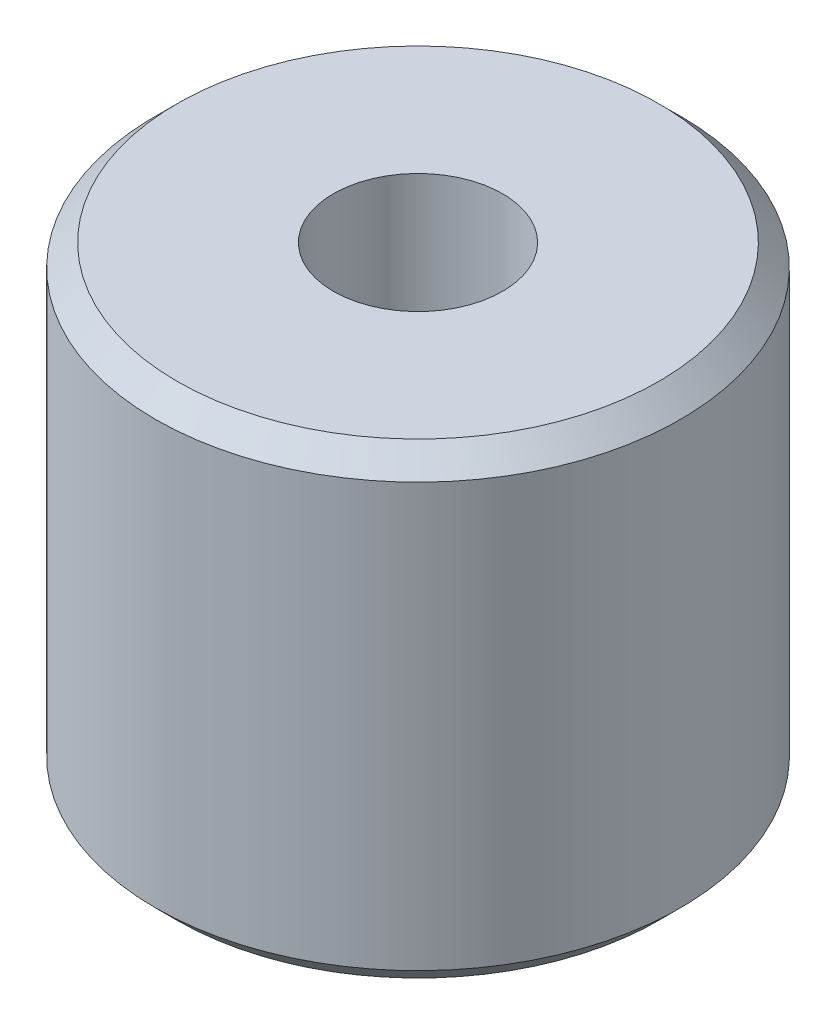
ISO-10303-21;
HEADER;
FILE_DESCRIPTION(('STEP AP214'),'2;1');
FILE_NAME('part.step','',(''),(''),'','','');
FILE_SCHEMA(('AUTOMOTIVE_DESIGN { 1 0 10303 214 1 1 1 1 }'));
ENDSEC;
DATA;
#1=APPLICATION_CONTEXT('core data for automotive mechanical design processes');
#2=APPLICATION_PROTOCOL_DEFINITION('international standard','automotive_design',2000,#1);
#3=PRODUCT_CONTEXT('',#1,'mechanical');
#4=PRODUCT('Part','Part','',(#3));
#5=PRODUCT_RELATED_PRODUCT_CATEGORY('part','',(#4));
#6=PRODUCT_DEFINITION_FORMATION('','',#4);
#7=PRODUCT_DEFINITION_CONTEXT('part definition',#1,'design');
#8=PRODUCT_DEFINITION('design','',#6,#7);
#9=PRODUCT_DEFINITION_SHAPE('','',#8);
#10=(LENGTH_UNIT() NAMED_UNIT(*) SI_UNIT(.MILLI.,.METRE.));
#11=(NAMED_UNIT(*) PLANE_ANGLE_UNIT() SI_UNIT($,.RADIAN.));
#12=(NAMED_UNIT(*) SI_UNIT($,.STERADIAN.) SOLID_ANGLE_UNIT());
#13=UNCERTAINTY_MEASURE_WITH_UNIT(LENGTH_MEASURE(1.E-05),#10,'distance_accuracy_value','');
#14=(GEOMETRIC_REPRESENTATION_CONTEXT(3) GLOBAL_UNCERTAINTY_ASSIGNED_CONTEXT((#13)) GLOBAL_UNIT_ASSIGNED_CONTEXT((#10,
#11,#12)) REPRESENTATION_CONTEXT('',''));
#15=CARTESIAN_POINT('',(0.,0.,0.));
#16=DIRECTION('',(0.,0.,1.));
#17=DIRECTION('',(1.,0.,0.));
#18=AXIS2_PLACEMENT_3D('',#15,#16,#17);
#19=CARTESIAN_POINT('',(0.,32.,0.));
#20=DIRECTION('',(0.,-1.,0.));
#21=DIRECTION('',(0.,0.,-1.));
#22=AXIS2_PLACEMENT_3D('',#19,#20,#21);
#23=CYLINDRICAL_SURFACE('',#22,18.);
#24=CARTESIAN_POINT('',(0.,30.5,0.));
#25=DIRECTION('',(0.,1.,0.));
#26=DIRECTION('',(0.,0.,1.));
#27=AXIS2_PLACEMENT_3D('',#24,#25,#26);
#28=CIRCLE('',#27,18.);
#29=CARTESIAN_POINT('',(0.,30.5,18.));
#30=VERTEX_POINT('',#29);
#31=EDGE_CURVE('E47',#30,#30,#28,.F.);
#32=ORIENTED_EDGE('',*,*,#31,.T.);
#33=EDGE_LOOP('',(#32));
#34=FACE_BOUND('',#33,.T.);
#35=CARTESIAN_POINT('',(0.,1.5,0.));
#36=DIRECTION('',(0.,1.,0.));
#37=DIRECTION('',(0.,0.,1.));
#38=AXIS2_PLACEMENT_3D('',#35,#36,#37);
#39=CIRCLE('',#38,18.);
#40=CARTESIAN_POINT('',(0.,1.5,18.));
#41=VERTEX_POINT('',#40);
#42=EDGE_CURVE('E51',#41,#41,#39,.T.);
#43=ORIENTED_EDGE('',*,*,#42,.T.);
#44=EDGE_LOOP('',(#43));
#45=FACE_BOUND('',#44,.T.);
#46=ADVANCED_FACE('F39',(#34,#45),#23,.T.);
#47=CARTESIAN_POINT('',(0.,32.,0.));
#48=DIRECTION('',(0.,1.,0.));
#49=DIRECTION('',(0.,0.,1.));
#50=AXIS2_PLACEMENT_3D('',#47,#48,#49);
#51=PLANE('',#50);
#52=CARTESIAN_POINT('',(0.,32.,0.));
#53=DIRECTION('',(0.,1.,0.));
#54=DIRECTION('',(0.,0.,1.));
#55=AXIS2_PLACEMENT_3D('',#52,#53,#54);
#56=CIRCLE('',#55,16.5);
#57=CARTESIAN_POINT('',(0.,32.,16.5));
#58=VERTEX_POINT('',#57);
#59=EDGE_CURVE('E55',#58,#58,#56,.T.);
#60=ORIENTED_EDGE('',*,*,#59,.T.);
#61=EDGE_LOOP('',(#60));
#62=FACE_BOUND('',#61,.T.);
#63=CARTESIAN_POINT('',(0.,32.,0.));
#64=DIRECTION('',(0.,1.,0.));
#65=DIRECTION('',(0.,0.,1.));
#66=AXIS2_PLACEMENT_3D('',#63,#64,#65);
#67=CIRCLE('',#66,5.8);
#68=CARTESIAN_POINT('',(0.,32.,5.8));
#69=VERTEX_POINT('',#68);
#70=EDGE_CURVE('E61',#69,#69,#67,.T.);
#71=ORIENTED_EDGE('',*,*,#70,.F.);
#72=EDGE_LOOP('',(#71));
#73=FACE_BOUND('',#72,.T.);
#74=ADVANCED_FACE('F76',(#62,#73),#51,.T.);
#75=CARTESIAN_POINT('',(0.,0.,0.));
#76=DIRECTION('',(0.,1.,0.));
#77=DIRECTION('',(0.,0.,1.));
#78=AXIS2_PLACEMENT_3D('',#75,#76,#77);
#79=PLANE('',#78);
#80=CARTESIAN_POINT('',(0.,0.,0.));
#81=DIRECTION('',(0.,1.,0.));
#82=DIRECTION('',(0.,0.,1.));
#83=AXIS2_PLACEMENT_3D('',#80,#81,#82);
#84=CIRCLE('',#83,16.5);
#85=CARTESIAN_POINT('',(0.,0.,16.5));
#86=VERTEX_POINT('',#85);
#87=EDGE_CURVE('E10',#86,#86,#84,.F.);
#88=ORIENTED_EDGE('',*,*,#87,.T.);
#89=EDGE_LOOP('',(#88));
#90=FACE_BOUND('',#89,.T.);
#91=CARTESIAN_POINT('',(0.,0.,0.));
#92=DIRECTION('',(0.,1.,0.));
#93=DIRECTION('',(0.,0.,1.));
#94=AXIS2_PLACEMENT_3D('',#91,#92,#93);
#95=CIRCLE('',#94,5.8);
#96=CARTESIAN_POINT('',(0.,0.,5.8));
#97=VERTEX_POINT('',#96);
#98=EDGE_CURVE('E60',#97,#97,#95,.T.);
#99=ORIENTED_EDGE('',*,*,#98,.T.);
#100=EDGE_LOOP('',(#99));
#101=FACE_BOUND('',#100,.T.);
#102=ADVANCED_FACE('F67',(#90,#101),#79,.F.);
#103=CARTESIAN_POINT('',(0.,0.,0.));
#104=DIRECTION('',(0.,1.,0.));
#105=DIRECTION('',(0.,0.,1.));
#106=AXIS2_PLACEMENT_3D('',#103,#104,#105);
#107=CYLINDRICAL_SURFACE('',#106,5.8);
#108=ORIENTED_EDGE('',*,*,#98,.F.);
#109=EDGE_LOOP('',(#108));
#110=FACE_BOUND('',#109,.T.);
#111=ORIENTED_EDGE('',*,*,#70,.T.);
#112=EDGE_LOOP('',(#111));
#113=FACE_BOUND('',#112,.T.);
#114=ADVANCED_FACE('F69',(#110,#113),#107,.F.);
#115=CARTESIAN_POINT('',(0.,32.,0.));
#116=DIRECTION('',(0.,-1.,0.));
#117=DIRECTION('',(0.,0.,-1.));
#118=AXIS2_PLACEMENT_3D('',#115,#116,#117);
#119=CONICAL_SURFACE('',#118,16.5,0.785398163397444);
#120=ORIENTED_EDGE('',*,*,#31,.F.);
#121=EDGE_LOOP('',(#120));
#122=FACE_BOUND('',#121,.T.);
#123=ORIENTED_EDGE('',*,*,#59,.F.);
#124=EDGE_LOOP('',(#123));
#125=FACE_BOUND('',#124,.T.);
#126=ADVANCED_FACE('F72',(#122,#125),#119,.T.);
#127=CARTESIAN_POINT('',(0.,1.5,0.));
#128=DIRECTION('',(0.,1.,0.));
#129=DIRECTION('',(0.,0.,1.));
#130=AXIS2_PLACEMENT_3D('',#127,#128,#129);
#131=CONICAL_SURFACE('',#130,18.,0.785398163397451);
#132=ORIENTED_EDGE('',*,*,#87,.F.);
#133=EDGE_LOOP('',(#132));
#134=FACE_BOUND('',#133,.T.);
#135=ORIENTED_EDGE('',*,*,#42,.F.);
#136=EDGE_LOOP('',(#135));
#137=FACE_BOUND('',#136,.T.);
#138=ADVANCED_FACE('F42',(#134,#137),#131,.T.);
#139=CLOSED_SHELL('',(#46,#74,#102,#114,#126,#138));
#140=MANIFOLD_SOLID_BREP('B2',#139);
#141=ADVANCED_BREP_SHAPE_REPRESENTATION('',(#18,#140),#14);
#142=SHAPE_DEFINITION_REPRESENTATION(#9,#141);
ENDSEC;
END-ISO-10303-21;
